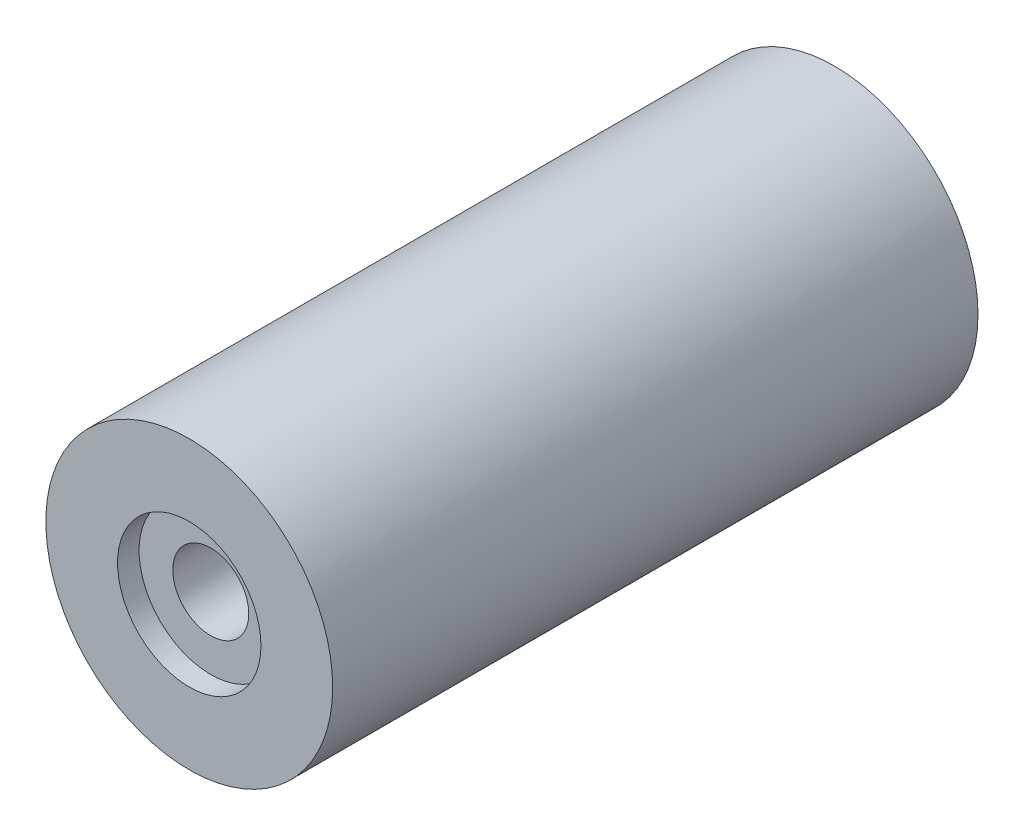
ISO-10303-21;
HEADER;
FILE_DESCRIPTION(('STEP AP214'),'2;1');
FILE_NAME('part.step','',(''),(''),'','','');
FILE_SCHEMA(('AUTOMOTIVE_DESIGN { 1 0 10303 214 1 1 1 1 }'));
ENDSEC;
DATA;
#1=APPLICATION_CONTEXT('core data for automotive mechanical design processes');
#2=APPLICATION_PROTOCOL_DEFINITION('international standard','automotive_design',2000,#1);
#3=PRODUCT_CONTEXT('',#1,'mechanical');
#4=PRODUCT('Part','Part','',(#3));
#5=PRODUCT_RELATED_PRODUCT_CATEGORY('part','',(#4));
#6=PRODUCT_DEFINITION_FORMATION('','',#4);
#7=PRODUCT_DEFINITION_CONTEXT('part definition',#1,'design');
#8=PRODUCT_DEFINITION('design','',#6,#7);
#9=PRODUCT_DEFINITION_SHAPE('','',#8);
#10=(LENGTH_UNIT() NAMED_UNIT(*) SI_UNIT(.MILLI.,.METRE.));
#11=(NAMED_UNIT(*) PLANE_ANGLE_UNIT() SI_UNIT($,.RADIAN.));
#12=(NAMED_UNIT(*) SI_UNIT($,.STERADIAN.) SOLID_ANGLE_UNIT());
#13=UNCERTAINTY_MEASURE_WITH_UNIT(LENGTH_MEASURE(1.E-05),#10,'distance_accuracy_value','');
#14=(GEOMETRIC_REPRESENTATION_CONTEXT(3) GLOBAL_UNCERTAINTY_ASSIGNED_CONTEXT((#13)) GLOBAL_UNIT_ASSIGNED_CONTEXT((#10,
#11,#12)) REPRESENTATION_CONTEXT('',''));
#15=CARTESIAN_POINT('',(0.,0.,0.));
#16=DIRECTION('',(0.,0.,1.));
#17=DIRECTION('',(1.,0.,0.));
#18=AXIS2_PLACEMENT_3D('',#15,#16,#17);
#19=CARTESIAN_POINT('',(0.,0.,-45.));
#20=DIRECTION('',(0.,0.,1.));
#21=DIRECTION('',(1.,0.,0.));
#22=AXIS2_PLACEMENT_3D('',#19,#20,#21);
#23=CYLINDRICAL_SURFACE('',#22,2.65);
#24=CARTESIAN_POINT('',(0.,0.,-45.));
#25=DIRECTION('',(0.,0.,1.));
#26=DIRECTION('',(1.,0.,0.));
#27=AXIS2_PLACEMENT_3D('',#24,#25,#26);
#28=CIRCLE('',#27,2.65);
#29=CARTESIAN_POINT('',(2.65,0.,-45.));
#30=VERTEX_POINT('',#29);
#31=EDGE_CURVE('E58',#30,#30,#28,.T.);
#32=CARTESIAN_POINT('',(0.,0.,-1.5));
#33=DIRECTION('',(0.,0.,1.));
#34=DIRECTION('',(1.,0.,0.));
#35=AXIS2_PLACEMENT_3D('',#32,#33,#34);
#36=CIRCLE('',#35,2.65);
#37=CARTESIAN_POINT('',(2.65,0.,-1.50000000000001));
#38=VERTEX_POINT('',#37);
#39=EDGE_CURVE('E47',#38,#38,#36,.F.);
#40=CARTESIAN_POINT('',(2.65,0.,-45.));
#41=CARTESIAN_POINT('',(2.65,0.,-44.546875));
#42=CARTESIAN_POINT('',(2.65,0.,-44.09375));
#43=CARTESIAN_POINT('',(2.65,0.,-43.1875));
#44=CARTESIAN_POINT('',(2.65,0.,-42.734375));
#45=CARTESIAN_POINT('',(2.65,0.,-41.828125));
#46=CARTESIAN_POINT('',(2.65,0.,-41.375));
#47=CARTESIAN_POINT('',(2.65,0.,-40.46875));
#48=CARTESIAN_POINT('',(2.65,0.,-40.015625));
#49=CARTESIAN_POINT('',(2.65,0.,-39.109375));
#50=CARTESIAN_POINT('',(2.65,0.,-38.65625));
#51=CARTESIAN_POINT('',(2.65,0.,-37.75));
#52=CARTESIAN_POINT('',(2.65,0.,-37.296875));
#53=CARTESIAN_POINT('',(2.65,0.,-36.390625));
#54=CARTESIAN_POINT('',(2.65,0.,-35.9375));
#55=CARTESIAN_POINT('',(2.65,0.,-35.03125));
#56=CARTESIAN_POINT('',(2.65,0.,-34.578125));
#57=CARTESIAN_POINT('',(2.65,0.,-33.671875));
#58=CARTESIAN_POINT('',(2.65,0.,-33.21875));
#59=CARTESIAN_POINT('',(2.65,0.,-32.3125));
#60=CARTESIAN_POINT('',(2.65,0.,-31.859375));
#61=CARTESIAN_POINT('',(2.65,0.,-30.953125));
#62=CARTESIAN_POINT('',(2.65,0.,-30.5));
#63=CARTESIAN_POINT('',(2.65,0.,-29.59375));
#64=CARTESIAN_POINT('',(2.65,0.,-29.140625));
#65=CARTESIAN_POINT('',(2.65,0.,-28.234375));
#66=CARTESIAN_POINT('',(2.65,0.,-27.78125));
#67=CARTESIAN_POINT('',(2.65,0.,-26.875));
#68=CARTESIAN_POINT('',(2.65,0.,-26.421875));
#69=CARTESIAN_POINT('',(2.65,0.,-25.515625));
#70=CARTESIAN_POINT('',(2.65,0.,-25.0625));
#71=CARTESIAN_POINT('',(2.65,0.,-24.15625));
#72=CARTESIAN_POINT('',(2.65,0.,-23.703125));
#73=CARTESIAN_POINT('',(2.65,0.,-22.796875));
#74=CARTESIAN_POINT('',(2.65,0.,-22.34375));
#75=CARTESIAN_POINT('',(2.65,0.,-21.4375));
#76=CARTESIAN_POINT('',(2.65,0.,-20.984375));
#77=CARTESIAN_POINT('',(2.65,0.,-20.078125));
#78=CARTESIAN_POINT('',(2.65,0.,-19.625));
#79=CARTESIAN_POINT('',(2.65,0.,-18.71875));
#80=CARTESIAN_POINT('',(2.65,0.,-18.265625));
#81=CARTESIAN_POINT('',(2.65,0.,-17.359375));
#82=CARTESIAN_POINT('',(2.65,0.,-16.90625));
#83=CARTESIAN_POINT('',(2.65,0.,-16.));
#84=CARTESIAN_POINT('',(2.65,0.,-15.546875));
#85=CARTESIAN_POINT('',(2.65,0.,-14.640625));
#86=CARTESIAN_POINT('',(2.65,0.,-14.1875));
#87=CARTESIAN_POINT('',(2.65,0.,-13.28125));
#88=CARTESIAN_POINT('',(2.65,0.,-12.828125));
#89=CARTESIAN_POINT('',(2.65,0.,-11.921875));
#90=CARTESIAN_POINT('',(2.65,0.,-11.46875));
#91=CARTESIAN_POINT('',(2.65,0.,-10.5625));
#92=CARTESIAN_POINT('',(2.65,0.,-10.109375));
#93=CARTESIAN_POINT('',(2.65,0.,-9.20312500000001));
#94=CARTESIAN_POINT('',(2.65,0.,-8.75000000000001));
#95=CARTESIAN_POINT('',(2.65,0.,-7.84375000000001));
#96=CARTESIAN_POINT('',(2.65,0.,-7.39062500000001));
#97=CARTESIAN_POINT('',(2.65,0.,-6.48437500000001));
#98=CARTESIAN_POINT('',(2.65,0.,-6.03125000000001));
#99=CARTESIAN_POINT('',(2.65,0.,-5.12500000000001));
#100=CARTESIAN_POINT('',(2.65,0.,-4.67187500000001));
#101=CARTESIAN_POINT('',(2.65,0.,-3.76562500000001));
#102=CARTESIAN_POINT('',(2.65,0.,-3.31250000000001));
#103=CARTESIAN_POINT('',(2.65,0.,-2.40625000000001));
#104=CARTESIAN_POINT('',(2.65,0.,-1.95312500000001));
#105=CARTESIAN_POINT('',(2.65,0.,-1.50000000000001));
#106=B_SPLINE_CURVE_WITH_KNOTS('',3,(#40,#41,#42,#43,#44,#45,#46,#47,#48,#49,#50,#51,#52,#53,
#54,#55,#56,#57,#58,#59,#60,#61,#62,#63,#64,#65,#66,#67,#68,#69,#70,#71,#72,#73,#74,#75,#76,#77,
#78,#79,#80,#81,#82,#83,#84,#85,#86,#87,#88,#89,#90,#91,#92,#93,#94,#95,#96,#97,#98,#99,#100,
#101,#102,#103,#104,#105),.UNSPECIFIED.,.F.,.F.,(4,2,2,2,2,2,2,2,2,2,2,2,2,2,2,2,2,2,2,2,2,2,2,
2,2,2,2,2,2,2,2,2,4),(0.,1.359375,2.71875000000001,4.078125,5.4375,6.796875,8.15625,
9.51562500000001,10.875,12.234375,13.59375,14.953125,16.3125,17.671875,19.03125,20.390625,21.75,
23.109375,24.46875,25.828125,27.1875,28.546875,29.90625,31.265625,32.625,33.984375,35.34375,
36.703125,38.0625,39.421875,40.78125,42.140625,43.5),.UNSPECIFIED.);
#107=EDGE_CURVE('BSEAM43',#30,#38,#106,.T.);
#108=ORIENTED_EDGE('',*,*,#31,.F.);
#109=ORIENTED_EDGE('',*,*,#39,.F.);
#110=ORIENTED_EDGE('',*,*,#107,.T.);
#111=ORIENTED_EDGE('',*,*,#107,.F.);
#112=EDGE_LOOP('',(#108,#110,#109,#111));
#113=FACE_BOUND('',#112,.T.);
#114=ADVANCED_FACE('F43',(#113),#23,.F.);
#115=CARTESIAN_POINT('',(0.,0.,-45.));
#116=DIRECTION('',(0.,0.,1.));
#117=DIRECTION('',(1.,0.,0.));
#118=AXIS2_PLACEMENT_3D('',#115,#116,#117);
#119=CYLINDRICAL_SURFACE('',#118,10.);
#120=CARTESIAN_POINT('',(0.,0.,-45.));
#121=DIRECTION('',(0.,0.,1.));
#122=DIRECTION('',(1.,0.,0.));
#123=AXIS2_PLACEMENT_3D('',#120,#121,#122);
#124=CIRCLE('',#123,10.);
#125=CARTESIAN_POINT('',(10.,0.,-45.));
#126=VERTEX_POINT('',#125);
#127=EDGE_CURVE('E10',#126,#126,#124,.T.);
#128=CARTESIAN_POINT('',(0.,0.,0.));
#129=DIRECTION('',(0.,0.,1.));
#130=DIRECTION('',(1.,0.,0.));
#131=AXIS2_PLACEMENT_3D('',#128,#129,#130);
#132=CIRCLE('',#131,10.);
#133=CARTESIAN_POINT('',(10.,0.,0.));
#134=VERTEX_POINT('',#133);
#135=EDGE_CURVE('E52',#134,#134,#132,.T.);
#136=CARTESIAN_POINT('',(10.,0.,-45.));
#137=CARTESIAN_POINT('',(10.,0.,-44.53125));
#138=CARTESIAN_POINT('',(10.,0.,-44.0625));
#139=CARTESIAN_POINT('',(10.,0.,-43.125));
#140=CARTESIAN_POINT('',(10.,0.,-42.65625));
#141=CARTESIAN_POINT('',(10.,0.,-41.71875));
#142=CARTESIAN_POINT('',(10.,0.,-41.25));
#143=CARTESIAN_POINT('',(10.,0.,-40.3125));
#144=CARTESIAN_POINT('',(10.,0.,-39.84375));
#145=CARTESIAN_POINT('',(10.,0.,-38.90625));
#146=CARTESIAN_POINT('',(10.,0.,-38.4375));
#147=CARTESIAN_POINT('',(10.,0.,-37.5));
#148=CARTESIAN_POINT('',(10.,0.,-37.03125));
#149=CARTESIAN_POINT('',(10.,0.,-36.09375));
#150=CARTESIAN_POINT('',(10.,0.,-35.625));
#151=CARTESIAN_POINT('',(10.,0.,-34.6875));
#152=CARTESIAN_POINT('',(10.,0.,-34.21875));
#153=CARTESIAN_POINT('',(10.,0.,-33.28125));
#154=CARTESIAN_POINT('',(10.,0.,-32.8125));
#155=CARTESIAN_POINT('',(10.,0.,-31.875));
#156=CARTESIAN_POINT('',(10.,0.,-31.40625));
#157=CARTESIAN_POINT('',(10.,0.,-30.46875));
#158=CARTESIAN_POINT('',(10.,0.,-30.));
#159=CARTESIAN_POINT('',(10.,0.,-29.0625));
#160=CARTESIAN_POINT('',(10.,0.,-28.59375));
#161=CARTESIAN_POINT('',(10.,0.,-27.65625));
#162=CARTESIAN_POINT('',(10.,0.,-27.1875));
#163=CARTESIAN_POINT('',(10.,0.,-26.25));
#164=CARTESIAN_POINT('',(10.,0.,-25.78125));
#165=CARTESIAN_POINT('',(10.,0.,-24.84375));
#166=CARTESIAN_POINT('',(10.,0.,-24.375));
#167=CARTESIAN_POINT('',(10.,0.,-23.4375));
#168=CARTESIAN_POINT('',(10.,0.,-22.96875));
#169=CARTESIAN_POINT('',(10.,0.,-22.03125));
#170=CARTESIAN_POINT('',(10.,0.,-21.5625));
#171=CARTESIAN_POINT('',(10.,0.,-20.625));
#172=CARTESIAN_POINT('',(10.,0.,-20.15625));
#173=CARTESIAN_POINT('',(10.,0.,-19.21875));
#174=CARTESIAN_POINT('',(10.,0.,-18.75));
#175=CARTESIAN_POINT('',(10.,0.,-17.8125));
#176=CARTESIAN_POINT('',(10.,0.,-17.34375));
#177=CARTESIAN_POINT('',(10.,0.,-16.40625));
#178=CARTESIAN_POINT('',(10.,0.,-15.9375));
#179=CARTESIAN_POINT('',(10.,0.,-15.));
#180=CARTESIAN_POINT('',(10.,0.,-14.53125));
#181=CARTESIAN_POINT('',(10.,0.,-13.59375));
#182=CARTESIAN_POINT('',(10.,0.,-13.125));
#183=CARTESIAN_POINT('',(10.,0.,-12.1875));
#184=CARTESIAN_POINT('',(10.,0.,-11.71875));
#185=CARTESIAN_POINT('',(10.,0.,-10.78125));
#186=CARTESIAN_POINT('',(10.,0.,-10.3125));
#187=CARTESIAN_POINT('',(10.,0.,-9.37500000000001));
#188=CARTESIAN_POINT('',(10.,0.,-8.90625000000001));
#189=CARTESIAN_POINT('',(10.,0.,-7.96875000000001));
#190=CARTESIAN_POINT('',(10.,0.,-7.50000000000001));
#191=CARTESIAN_POINT('',(10.,0.,-6.56250000000001));
#192=CARTESIAN_POINT('',(10.,0.,-6.09375000000001));
#193=CARTESIAN_POINT('',(10.,0.,-5.15625000000001));
#194=CARTESIAN_POINT('',(10.,0.,-4.68750000000001));
#195=CARTESIAN_POINT('',(10.,0.,-3.75000000000001));
#196=CARTESIAN_POINT('',(10.,0.,-3.28125000000001));
#197=CARTESIAN_POINT('',(10.,0.,-2.34375000000001));
#198=CARTESIAN_POINT('',(10.,0.,-1.87500000000001));
#199=CARTESIAN_POINT('',(10.,0.,-0.937500000000006));
#200=CARTESIAN_POINT('',(10.,0.,-0.468750000000007));
#201=CARTESIAN_POINT('',(10.,0.,0.));
#202=B_SPLINE_CURVE_WITH_KNOTS('',3,(#136,#137,#138,#139,#140,#141,#142,#143,#144,#145,#146,
#147,#148,#149,#150,#151,#152,#153,#154,#155,#156,#157,#158,#159,#160,#161,#162,#163,#164,#165,
#166,#167,#168,#169,#170,#171,#172,#173,#174,#175,#176,#177,#178,#179,#180,#181,#182,#183,#184,
#185,#186,#187,#188,#189,#190,#191,#192,#193,#194,#195,#196,#197,#198,#199,#200,#201),
.UNSPECIFIED.,.F.,.F.,(4,2,2,2,2,2,2,2,2,2,2,2,2,2,2,2,2,2,2,2,2,2,2,2,2,2,2,2,2,2,2,2,4),(0.,
1.40625,2.8125,4.21875,5.62500000000001,7.03125,8.4375,9.84375000000001,11.25,12.65625,14.0625,
15.46875,16.875,18.28125,19.6875,21.09375,22.5,23.90625,25.3125,26.71875,28.125,29.53125,
30.9375,32.34375,33.75,35.15625,36.5625,37.96875,39.375,40.78125,42.1875,43.59375,45.),.UNSPECIFIED.);
#203=EDGE_CURVE('BSEAM45',#126,#134,#202,.T.);
#204=ORIENTED_EDGE('',*,*,#127,.T.);
#205=ORIENTED_EDGE('',*,*,#135,.F.);
#206=ORIENTED_EDGE('',*,*,#203,.T.);
#207=ORIENTED_EDGE('',*,*,#203,.F.);
#208=EDGE_LOOP('',(#204,#206,#205,#207));
#209=FACE_BOUND('',#208,.T.);
#210=ADVANCED_FACE('F45',(#209),#119,.T.);
#211=CARTESIAN_POINT('',(0.,0.,-45.));
#212=DIRECTION('',(0.,0.,1.));
#213=DIRECTION('',(1.,0.,0.));
#214=AXIS2_PLACEMENT_3D('',#211,#212,#213);
#215=PLANE('',#214);
#216=ORIENTED_EDGE('',*,*,#31,.T.);
#217=EDGE_LOOP('',(#216));
#218=FACE_BOUND('',#217,.T.);
#219=ORIENTED_EDGE('',*,*,#127,.F.);
#220=EDGE_LOOP('',(#219));
#221=FACE_BOUND('',#220,.T.);
#222=ADVANCED_FACE('F86',(#218,#221),#215,.F.);
#223=CARTESIAN_POINT('',(0.,0.,0.));
#224=DIRECTION('',(0.,0.,1.));
#225=DIRECTION('',(1.,0.,0.));
#226=AXIS2_PLACEMENT_3D('',#223,#224,#225);
#227=PLANE('',#226);
#228=CARTESIAN_POINT('',(0.,0.,0.));
#229=DIRECTION('',(0.,0.,1.));
#230=DIRECTION('',(1.,0.,0.));
#231=AXIS2_PLACEMENT_3D('',#228,#229,#230);
#232=CIRCLE('',#231,5.);
#233=CARTESIAN_POINT('',(5.,0.,0.));
#234=VERTEX_POINT('',#233);
#235=EDGE_CURVE('E63',#234,#234,#232,.T.);
#236=ORIENTED_EDGE('',*,*,#235,.F.);
#237=EDGE_LOOP('',(#236));
#238=FACE_BOUND('',#237,.T.);
#239=ORIENTED_EDGE('',*,*,#135,.T.);
#240=EDGE_LOOP('',(#239));
#241=FACE_BOUND('',#240,.T.);
#242=ADVANCED_FACE('F92',(#238,#241),#227,.T.);
#243=CARTESIAN_POINT('',(0.,0.,-1.5));
#244=DIRECTION('',(0.,0.,1.));
#245=DIRECTION('',(1.,0.,0.));
#246=AXIS2_PLACEMENT_3D('',#243,#244,#245);
#247=PLANE('',#246);
#248=CARTESIAN_POINT('',(0.,0.,-1.5));
#249=DIRECTION('',(0.,0.,1.));
#250=DIRECTION('',(1.,0.,0.));
#251=AXIS2_PLACEMENT_3D('',#248,#249,#250);
#252=CIRCLE('',#251,5.);
#253=CARTESIAN_POINT('',(5.,0.,-1.5));
#254=VERTEX_POINT('',#253);
#255=EDGE_CURVE('E67',#254,#254,#252,.T.);
#256=ORIENTED_EDGE('',*,*,#255,.T.);
#257=EDGE_LOOP('',(#256));
#258=FACE_BOUND('',#257,.T.);
#259=ORIENTED_EDGE('',*,*,#39,.T.);
#260=EDGE_LOOP('',(#259));
#261=FACE_BOUND('',#260,.T.);
#262=ADVANCED_FACE('F76',(#258,#261),#247,.T.);
#263=CARTESIAN_POINT('',(0.,0.,-1.5));
#264=DIRECTION('',(0.,0.,1.));
#265=DIRECTION('',(1.,0.,0.));
#266=AXIS2_PLACEMENT_3D('',#263,#264,#265);
#267=CYLINDRICAL_SURFACE('',#266,5.);
#268=ORIENTED_EDGE('',*,*,#255,.F.);
#269=EDGE_LOOP('',(#268));
#270=FACE_BOUND('',#269,.T.);
#271=ORIENTED_EDGE('',*,*,#235,.T.);
#272=EDGE_LOOP('',(#271));
#273=FACE_BOUND('',#272,.T.);
#274=ADVANCED_FACE('F90',(#270,#273),#267,.F.);
#275=CLOSED_SHELL('',(#114,#210,#222,#242,#262,#274));
#276=MANIFOLD_SOLID_BREP('B2',#275);
#277=ADVANCED_BREP_SHAPE_REPRESENTATION('',(#18,#276),#14);
#278=SHAPE_DEFINITION_REPRESENTATION(#9,#277);
ENDSEC;
END-ISO-10303-21;
